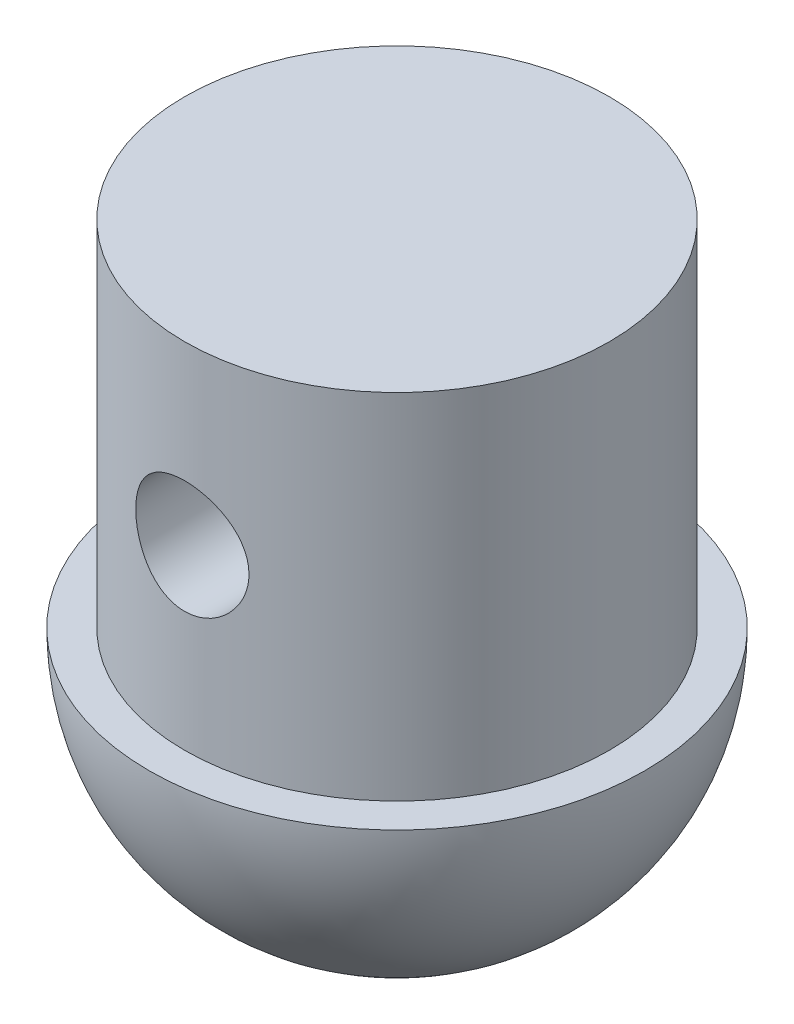
ISO-10303-21;
HEADER;
FILE_DESCRIPTION(('STEP AP214'),'2;1');
FILE_NAME('part.step','',(''),(''),'','','');
FILE_SCHEMA(('AUTOMOTIVE_DESIGN { 1 0 10303 214 1 1 1 1 }'));
ENDSEC;
DATA;
#1=APPLICATION_CONTEXT('core data for automotive mechanical design processes');
#2=APPLICATION_PROTOCOL_DEFINITION('international standard','automotive_design',2000,#1);
#3=PRODUCT_CONTEXT('',#1,'mechanical');
#4=PRODUCT('Part','Part','',(#3));
#5=PRODUCT_RELATED_PRODUCT_CATEGORY('part','',(#4));
#6=PRODUCT_DEFINITION_FORMATION('','',#4);
#7=PRODUCT_DEFINITION_CONTEXT('part definition',#1,'design');
#8=PRODUCT_DEFINITION('design','',#6,#7);
#9=PRODUCT_DEFINITION_SHAPE('','',#8);
#10=(LENGTH_UNIT() NAMED_UNIT(*) SI_UNIT(.MILLI.,.METRE.));
#11=(NAMED_UNIT(*) PLANE_ANGLE_UNIT() SI_UNIT($,.RADIAN.));
#12=(NAMED_UNIT(*) SI_UNIT($,.STERADIAN.) SOLID_ANGLE_UNIT());
#13=UNCERTAINTY_MEASURE_WITH_UNIT(LENGTH_MEASURE(1.E-05),#10,'distance_accuracy_value','');
#14=(GEOMETRIC_REPRESENTATION_CONTEXT(3) GLOBAL_UNCERTAINTY_ASSIGNED_CONTEXT((#13)) GLOBAL_UNIT_ASSIGNED_CONTEXT((#10,
#11,#12)) REPRESENTATION_CONTEXT('',''));
#15=CARTESIAN_POINT('',(0.,0.,0.));
#16=DIRECTION('',(0.,0.,1.));
#17=DIRECTION('',(1.,0.,0.));
#18=AXIS2_PLACEMENT_3D('',#15,#16,#17);
#19=CARTESIAN_POINT('',(0.,0.,0.));
#20=DIRECTION('',(0.,1.,0.));
#21=DIRECTION('',(1.,0.,0.));
#22=AXIS2_PLACEMENT_3D('',#19,#20,#21);
#23=SPHERICAL_SURFACE('',#22,7.);
#24=CARTESIAN_POINT('',(0.,0.,0.));
#25=DIRECTION('',(0.,1.,0.));
#26=DIRECTION('',(0.,0.,1.));
#27=AXIS2_PLACEMENT_3D('',#24,#25,#26);
#28=CIRCLE('',#27,7.);
#29=CARTESIAN_POINT('',(0.,0.,7.));
#30=VERTEX_POINT('',#29);
#31=EDGE_CURVE('E54',#30,#30,#28,.T.);
#32=ORIENTED_EDGE('',*,*,#31,.F.);
#33=EDGE_LOOP('',(#32));
#34=FACE_BOUND('',#33,.T.);
#35=ADVANCED_FACE('F43',(#34),#23,.T.);
#36=CARTESIAN_POINT('',(-7.49229768381106,0.,7.));
#37=DIRECTION('',(0.,-1.,0.));
#38=DIRECTION('',(0.,0.,1.));
#39=AXIS2_PLACEMENT_3D('',#36,#37,#38);
#40=PLANE('',#39);
#41=CARTESIAN_POINT('',(0.,0.,0.));
#42=DIRECTION('',(0.,1.,0.));
#43=DIRECTION('',(0.,0.,1.));
#44=AXIS2_PLACEMENT_3D('',#41,#42,#43);
#45=CIRCLE('',#44,6.);
#46=CARTESIAN_POINT('',(0.,0.,6.));
#47=VERTEX_POINT('',#46);
#48=EDGE_CURVE('E11',#47,#47,#45,.F.);
#49=ORIENTED_EDGE('',*,*,#48,.T.);
#50=EDGE_LOOP('',(#49));
#51=FACE_BOUND('',#50,.T.);
#52=ORIENTED_EDGE('',*,*,#31,.T.);
#53=EDGE_LOOP('',(#52));
#54=FACE_BOUND('',#53,.T.);
#55=ADVANCED_FACE('F73',(#51,#54),#40,.F.);
#56=CARTESIAN_POINT('',(0.,10.,0.));
#57=DIRECTION('',(0.,-1.,0.));
#58=DIRECTION('',(0.,0.,1.));
#59=AXIS2_PLACEMENT_3D('',#56,#57,#58);
#60=CYLINDRICAL_SURFACE('',#59,6.);
#61=CARTESIAN_POINT('',(0.,6.6,6.));
#62=CARTESIAN_POINT('',(-0.0882036446662835,6.59999790645212,5.9999986704813));
#63=CARTESIAN_POINT('',(-0.176429728177472,6.59268190864826,5.99803588929723));
#64=CARTESIAN_POINT('',(-0.350340361083571,6.56366301540905,5.99039658897325));
#65=CARTESIAN_POINT('',(-0.436023666655269,6.54195319645911,5.98471828266059));
#66=CARTESIAN_POINT('',(-0.60231327123625,6.48490266650877,5.97027466602242));
#67=CARTESIAN_POINT('',(-0.682925960812229,6.44957952986717,5.96151333704337));
#68=CARTESIAN_POINT('',(-0.837082949114126,6.36637020586672,5.94182959321305));
#69=CARTESIAN_POINT('',(-0.910626776359695,6.31848318131261,5.93090703436005));
#70=CARTESIAN_POINT('',(-1.05026360299202,6.21033318686926,5.90779691921738));
#71=CARTESIAN_POINT('',(-1.11616935189025,6.14983306559322,5.8955877414348));
#72=CARTESIAN_POINT('',(-1.23702970928508,6.01868121354948,5.87141927743138));
#73=CARTESIAN_POINT('',(-1.29198290796523,5.94802817790661,5.85946002355797));
#74=CARTESIAN_POINT('',(-1.39029127394741,5.797081412139,5.83692429973529));
#75=CARTESIAN_POINT('',(-1.43343102189222,5.71664293738822,5.82637510858234));
#76=CARTESIAN_POINT('',(-1.50550038461563,5.54932791112846,5.80817181846909));
#77=CARTESIAN_POINT('',(-1.53443261960976,5.46245255014382,5.8005171857408));
#78=CARTESIAN_POINT('',(-1.5766153618114,5.28680356973868,5.78919292669855));
#79=CARTESIAN_POINT('',(-1.59020536195949,5.19811716803828,5.78543718352246));
#80=CARTESIAN_POINT('',(-1.60237627764874,5.01964985333367,5.78207864835752));
#81=CARTESIAN_POINT('',(-1.60095999764589,4.92986914797151,5.78247508038722));
#82=CARTESIAN_POINT('',(-1.58342808002097,4.7544116677021,5.78729903015237));
#83=CARTESIAN_POINT('',(-1.56772324851795,4.66869025436957,5.79161388402152));
#84=CARTESIAN_POINT('',(-1.52271798977763,4.50114533243464,5.80360810471625));
#85=CARTESIAN_POINT('',(-1.493416475944,4.41932213593963,5.81128774043995));
#86=CARTESIAN_POINT('',(-1.421714855722,4.26082548495324,5.82924529396782));
#87=CARTESIAN_POINT('',(-1.37917072910226,4.18422052857102,5.83955154254446));
#88=CARTESIAN_POINT('',(-1.28229203059023,4.03909267291875,5.86158583714473));
#89=CARTESIAN_POINT('',(-1.22795513779401,3.97057136867482,5.8733141628429));
#90=CARTESIAN_POINT('',(-1.10693285810735,3.84120880203617,5.89734008503746));
#91=CARTESIAN_POINT('',(-1.03990250182639,3.78069094534804,5.90964377191026));
#92=CARTESIAN_POINT('',(-0.896494134565098,3.67168897571977,5.93309105021092));
#93=CARTESIAN_POINT('',(-0.820115755364072,3.62320533703806,5.94423459590854));
#94=CARTESIAN_POINT('',(-0.659678604397961,3.53950567774028,5.96417456318624));
#95=CARTESIAN_POINT('',(-0.575587922041431,3.50434818364113,5.97296058266845));
#96=CARTESIAN_POINT('',(-0.402401835512316,3.4487622489493,5.98712035520802));
#97=CARTESIAN_POINT('',(-0.313307529542658,3.42833058982083,5.99249485386999));
#98=CARTESIAN_POINT('',(-0.135403266516412,3.40328409846574,5.99911326846707));
#99=CARTESIAN_POINT('',(-0.0466593901131037,3.39822956811931,6.00047197976769));
#100=CARTESIAN_POINT('',(0.130408036720958,3.40286653139755,5.99923577353354));
#101=CARTESIAN_POINT('',(0.218731629649689,3.41255650088461,5.99664126464274));
#102=CARTESIAN_POINT('',(0.390881959921425,3.44604675796799,5.98786428396825));
#103=CARTESIAN_POINT('',(0.474759881622232,3.46960179695823,5.98174421237093));
#104=CARTESIAN_POINT('',(0.637365576940845,3.52986875560634,5.96661035915282));
#105=CARTESIAN_POINT('',(0.716092791372797,3.56658210100036,5.9575962639682));
#106=CARTESIAN_POINT('',(0.867870779734386,3.6529391097445,5.93740528447735));
#107=CARTESIAN_POINT('',(0.94078015076904,3.70282197343847,5.92618949284386));
#108=CARTESIAN_POINT('',(1.07734770831762,3.81380130412612,5.9028916189203));
#109=CARTESIAN_POINT('',(1.14100406303899,3.87489998607982,5.89080936580444));
#110=CARTESIAN_POINT('',(1.25911139583055,4.0086284619967,5.86671796694981));
#111=CARTESIAN_POINT('',(1.31325215399989,4.08153484912012,5.85472049149563));
#112=CARTESIAN_POINT('',(1.40853752947959,4.23565175687572,5.83253157740069));
#113=CARTESIAN_POINT('',(1.44968268897221,4.31686193088299,5.82234006342218));
#114=CARTESIAN_POINT('',(1.51749929269189,4.48487624567057,5.80503414721321));
#115=CARTESIAN_POINT('',(1.54425449804718,4.5716446494985,5.79790198738987));
#116=CARTESIAN_POINT('',(1.58272964096634,4.74867145578706,5.78751860185751));
#117=CARTESIAN_POINT('',(1.5944534208239,4.83892896029366,5.78426638438256));
#118=CARTESIAN_POINT('',(1.60231191722602,5.01719583029804,5.78209395637349));
#119=CARTESIAN_POINT('',(1.59894524494388,5.10518185620422,5.78303518188826));
#120=CARTESIAN_POINT('',(1.5778750080045,5.27928281121043,5.78881916870635));
#121=CARTESIAN_POINT('',(1.56017181228047,5.36539778840111,5.79366182961091));
#122=CARTESIAN_POINT('',(1.51122012559733,5.53268460170324,5.80662056856999));
#123=CARTESIAN_POINT('',(1.48007728860457,5.61388947418558,5.81471108015306));
#124=CARTESIAN_POINT('',(1.40521243649916,5.76998306442748,5.83325454509352));
#125=CARTESIAN_POINT('',(1.36148844819695,5.84487078904044,5.84370786897202));
#126=CARTESIAN_POINT('',(1.26119127415051,5.98858428759724,5.86618337152254));
#127=CARTESIAN_POINT('',(1.20427783814327,6.05716682798096,5.87824266481322));
#128=CARTESIAN_POINT('',(1.0798644280888,6.18396996133387,5.90236403026437));
#129=CARTESIAN_POINT('',(1.012361883487,6.24218803093508,5.91442610238761));
#130=CARTESIAN_POINT('',(0.866943984870946,6.34783379011748,5.93750249923166));
#131=CARTESIAN_POINT('',(0.788836769401423,6.39500400851946,5.94848889051638));
#132=CARTESIAN_POINT('',(0.625510912333512,6.47546993274349,5.9678704808232));
#133=CARTESIAN_POINT('',(0.540296875757037,6.50877454053088,5.97626734146876));
#134=CARTESIAN_POINT('',(0.379499763904792,6.55622022833241,5.98843802010774));
#135=CARTESIAN_POINT('',(0.304609613252028,6.572599506874,5.99274216474082));
#136=CARTESIAN_POINT('',(0.15315183625366,6.59448976493365,5.99852359229165));
#137=CARTESIAN_POINT('',(0.0765843763238879,6.60000181776002,6.00000115437816));
#138=CARTESIAN_POINT('',(0.,6.6,6.));
#139=B_SPLINE_CURVE_WITH_KNOTS('',3,(#61,#62,#63,#64,#65,#66,#67,#68,#69,#70,#71,#72,#73,#74,
#75,#76,#77,#78,#79,#80,#81,#82,#83,#84,#85,#86,#87,#88,#89,#90,#91,#92,#93,#94,#95,#96,#97,#98,
#99,#100,#101,#102,#103,#104,#105,#106,#107,#108,#109,#110,#111,#112,#113,#114,#115,#116,#117,
#118,#119,#120,#121,#122,#123,#124,#125,#126,#127,#128,#129,#130,#131,#132,#133,#134,#135,#136,
#137,#138),.UNSPECIFIED.,.T.,.F.,(4,2,2,2,2,2,2,2,2,2,2,2,2,2,2,2,2,2,2,2,2,2,2,2,2,2,2,2,2,2,2,
2,2,2,2,2,2,2,4),(0.,0.264330079159655,0.52878739500916,0.792904442377546,1.0570390936694,
1.32667918363974,1.59635395940119,1.87066066018583,2.1449167530376,2.41297726598071,
2.68098768318787,2.94152801632129,3.20208917445683,3.4655893867253,3.72914150489435,
4.00129007845189,4.27344937545409,4.54679047677765,4.82007181747443,5.08546174014969,
5.35082423135612,5.61162828509024,5.87246060615823,6.13840228798972,6.40439654602441,
6.67789197101562,6.95137598414617,7.2232503815319,7.49505526923061,7.75794673914764,
8.0208314440835,8.28168612350517,8.54258173690277,8.81115471648986,9.07979299457834,
9.35417801816593,9.62838660908019,9.85791855186544,10.0874278236498),.UNSPECIFIED.);
#140=CARTESIAN_POINT('',(0.,6.6,6.));
#141=VERTEX_POINT('',#140);
#142=EDGE_CURVE('E46',#141,#141,#139,.T.);
#143=ORIENTED_EDGE('',*,*,#142,.F.);
#144=EDGE_LOOP('',(#143));
#145=FACE_BOUND('',#144,.T.);
#146=CARTESIAN_POINT('',(1.6,5.,-5.78273291792039));
#147=CARTESIAN_POINT('',(1.59999787452612,4.91185924980899,-5.7827344455633));
#148=CARTESIAN_POINT('',(1.59269194579771,4.82369599961951,-5.78477011639344));
#149=CARTESIAN_POINT('',(1.56371666608212,4.64991566275457,-5.79266848924472));
#150=CARTESIAN_POINT('',(1.54204010896768,4.56429987601746,-5.79853311126453));
#151=CARTESIAN_POINT('',(1.48508676448053,4.39815354404267,-5.81337900141366));
#152=CARTESIAN_POINT('',(1.4498291003374,4.31761603293728,-5.82235588547335));
#153=CARTESIAN_POINT('',(1.36677427650964,4.16358660795211,-5.8424092393635));
#154=CARTESIAN_POINT('',(1.3189761427316,4.0900952419944,-5.85348587227547));
#155=CARTESIAN_POINT('',(1.21091878299647,3.95040596240983,-5.87680111642766));
#156=CARTESIAN_POINT('',(1.15040238003367,3.88441038602843,-5.88906032893152));
#157=CARTESIAN_POINT('',(1.01917941827217,3.76337473843904,-5.91318161149208));
#158=CARTESIAN_POINT('',(0.948471804277315,3.70833580308656,-5.92504364026752));
#159=CARTESIAN_POINT('',(0.797470536698616,3.60993204927766,-5.94726390774734));
#160=CARTESIAN_POINT('',(0.717041455903584,3.56676838509372,-5.95759501009834));
#161=CARTESIAN_POINT('',(0.549746435783273,3.49465229170619,-5.97535300969467));
#162=CARTESIAN_POINT('',(0.462881584700083,3.46569746617476,-5.9827803966101));
#163=CARTESIAN_POINT('',(0.287292769448073,3.42347582381139,-5.99374842861169));
#164=CARTESIAN_POINT('',(0.198656979360733,3.40986481869927,-5.99737421400212));
#165=CARTESIAN_POINT('',(0.0202908428068611,3.39763430391426,-6.000628196942));
#166=CARTESIAN_POINT('',(-0.0694393179508233,3.39901228509589,-6.00025706357286));
#167=CARTESIAN_POINT('',(-0.245051389689077,3.41647825003158,-5.99562140687813));
#168=CARTESIAN_POINT('',(-0.330973280576888,3.43219436610903,-5.99145531221602));
#169=CARTESIAN_POINT('',(-0.498913052456843,3.47728971022556,-5.97981398872374));
#170=CARTESIAN_POINT('',(-0.580930710544464,3.50666971734884,-5.97233857120463));
#171=CARTESIAN_POINT('',(-0.739683156118043,3.5785438780739,-5.95477255279922));
#172=CARTESIAN_POINT('',(-0.816357349063631,3.62116544568056,-5.94465670302171));
#173=CARTESIAN_POINT('',(-0.961591999011611,3.71821505560728,-5.9228997480757));
#174=CARTESIAN_POINT('',(-1.03015087046869,3.77264539922253,-5.91125834578275));
#175=CARTESIAN_POINT('',(-1.15942829557249,3.89374148634714,-5.88729018351104));
#176=CARTESIAN_POINT('',(-1.21984153614219,3.96073155603951,-5.87495335495478));
#177=CARTESIAN_POINT('',(-1.32865065683815,4.10401974099102,-5.85130724018329));
#178=CARTESIAN_POINT('',(-1.37704580423844,4.18031842336025,-5.83999801664631));
#179=CARTESIAN_POINT('',(-1.46067743349021,4.34072008145716,-5.81964721826454));
#180=CARTESIAN_POINT('',(-1.49583093280429,4.42486828073093,-5.81062005680583));
#181=CARTESIAN_POINT('',(-1.55139201348531,4.59818119956356,-5.79603460063156));
#182=CARTESIAN_POINT('',(-1.57180325169042,4.68734466915873,-5.79047544571885));
#183=CARTESIAN_POINT('',(-1.59677405674218,4.86530176881729,-5.78363868515234));
#184=CARTESIAN_POINT('',(-1.60178906096974,4.95402683888858,-5.78223810662157));
#185=CARTESIAN_POINT('',(-1.597079848984,5.13104781824197,-5.78354062803713));
#186=CARTESIAN_POINT('',(-1.58735720137773,5.21934377219377,-5.78624329125356));
#187=CARTESIAN_POINT('',(-1.55385017495931,5.39124527527808,-5.79532899431386));
#188=CARTESIAN_POINT('',(-1.53033958330325,5.47490835035108,-5.80164031753083));
#189=CARTESIAN_POINT('',(-1.47023189380392,5.63710370508665,-5.81716215168585));
#190=CARTESIAN_POINT('',(-1.43363308701324,5.71563531314159,-5.82637304120572));
#191=CARTESIAN_POINT('',(-1.34746324406962,5.86724396594853,-5.84690857976629));
#192=CARTESIAN_POINT('',(-1.29762476190339,5.94016318071188,-5.8582752389782));
#193=CARTESIAN_POINT('',(-1.18672182390013,6.07677064136243,-5.88174273547405));
#194=CARTESIAN_POINT('',(-1.12565525778373,6.14045714796329,-5.89384371048319));
#195=CARTESIAN_POINT('',(-0.991923026003871,6.25868197859996,-5.91783971907433));
#196=CARTESIAN_POINT('',(-0.918973132807077,6.31290270158287,-5.92971869219044));
#197=CARTESIAN_POINT('',(-0.764742748752595,6.40832878992841,-5.95157336013737));
#198=CARTESIAN_POINT('',(-0.683462701615108,6.44953484806313,-5.96154915626333));
#199=CARTESIAN_POINT('',(-0.515451307860698,6.51738370588921,-5.978409207194));
#200=CARTESIAN_POINT('',(-0.428766282305869,6.54413521555477,-5.98531646784308));
#201=CARTESIAN_POINT('',(-0.251919507785059,6.58263098245149,-5.99536243029798));
#202=CARTESIAN_POINT('',(-0.161758533856201,6.59437856541975,-5.99850196723977));
#203=CARTESIAN_POINT('',(0.0165136010769233,6.60232465899314,-6.0006193075016));
#204=CARTESIAN_POINT('',(0.104602809222308,6.59898905530491,-5.99972181030494));
#205=CARTESIAN_POINT('',(0.278918643704555,6.57794520513986,-5.9941479278306));
#206=CARTESIAN_POINT('',(0.365145339850183,6.56023749830647,-5.98947168443723));
#207=CARTESIAN_POINT('',(0.532728098771435,6.51121551606502,-5.97689048312844));
#208=CARTESIAN_POINT('',(0.614113609481483,6.47999576522167,-5.96900797751776));
#209=CARTESIAN_POINT('',(0.770537678776833,6.40492031860338,-5.95083853212803));
#210=CARTESIAN_POINT('',(0.845575345328785,6.36106285071116,-5.9405512551794));
#211=CARTESIAN_POINT('',(0.989342614939896,6.26059338228894,-5.91833064980799));
#212=CARTESIAN_POINT('',(1.05785068939027,6.20367249543562,-5.90636074702983));
#213=CARTESIAN_POINT('',(1.18450029724544,6.07927780051353,-5.88227200056129));
#214=CARTESIAN_POINT('',(1.24263909793084,6.0118012193649,-5.87015311850574));
#215=CARTESIAN_POINT('',(1.34816560187261,5.86642528332748,-5.84683167732792));
#216=CARTESIAN_POINT('',(1.39528875413901,5.7883293490008,-5.83565513061492));
#217=CARTESIAN_POINT('',(1.47566951228968,5.62503495123749,-5.81585115203583));
#218=CARTESIAN_POINT('',(1.50893618695116,5.53984117714822,-5.80722205399804));
#219=CARTESIAN_POINT('',(1.5563049940103,5.37913493117279,-5.79468800506476));
#220=CARTESIAN_POINT('',(1.57265214719335,5.30431898835834,-5.79024112213281));
#221=CARTESIAN_POINT('',(1.59449995435361,5.15300755360111,-5.78426308173731));
#222=CARTESIAN_POINT('',(1.60000184505801,5.07651225416789,-5.7827315918209));
#223=CARTESIAN_POINT('',(1.6,5.,-5.78273291792039));
#224=B_SPLINE_CURVE_WITH_KNOTS('',3,(#146,#147,#148,#149,#150,#151,#152,#153,#154,#155,#156,
#157,#158,#159,#160,#161,#162,#163,#164,#165,#166,#167,#168,#169,#170,#171,#172,#173,#174,#175,
#176,#177,#178,#179,#180,#181,#182,#183,#184,#185,#186,#187,#188,#189,#190,#191,#192,#193,#194,
#195,#196,#197,#198,#199,#200,#201,#202,#203,#204,#205,#206,#207,#208,#209,#210,#211,#212,#213,
#214,#215,#216,#217,#218,#219,#220,#221,#222,#223),.UNSPECIFIED.,.T.,.F.,(4,2,2,2,2,2,2,2,2,2,2,
2,2,2,2,2,2,2,2,2,2,2,2,2,2,2,2,2,2,2,2,2,2,2,2,2,2,2,4),(0.,0.264140902492821,
0.528414358280161,0.792317049276934,1.05624024524884,1.32612732904169,1.59604237699569,
1.87028165896643,2.14447467443397,2.41238643453184,2.68025334708482,2.94136456640643,
3.20249067552556,3.46621159124456,3.72998394715593,4.00185409840264,4.27374082111663,
4.54730412077229,4.82079953934806,5.08612267391536,5.35141757070658,5.61161480341915,
5.87184602287714,6.13779707970073,6.40379817229035,6.67748725563562,6.95116176802338,
7.22274831668976,7.4942746556306,7.75747243929026,8.02066034086225,8.28203611890788,
8.54344856608626,8.81183083189117,9.08028372300693,9.35464031183427,9.6288170567485,
9.85813574131029,10.0874282742632),.UNSPECIFIED.);
#225=CARTESIAN_POINT('',(1.6,5.,-5.78273291792039));
#226=VERTEX_POINT('',#225);
#227=EDGE_CURVE('E62',#226,#226,#224,.T.);
#228=ORIENTED_EDGE('',*,*,#227,.F.);
#229=EDGE_LOOP('',(#228));
#230=FACE_BOUND('',#229,.T.);
#231=CARTESIAN_POINT('',(0.,10.,0.));
#232=DIRECTION('',(0.,-1.,0.));
#233=DIRECTION('',(0.,0.,-1.));
#234=AXIS2_PLACEMENT_3D('',#231,#232,#233);
#235=CIRCLE('',#234,6.);
#236=CARTESIAN_POINT('',(0.,10.,-6.));
#237=VERTEX_POINT('',#236);
#238=EDGE_CURVE('E59',#237,#237,#235,.T.);
#239=ORIENTED_EDGE('',*,*,#238,.T.);
#240=EDGE_LOOP('',(#239));
#241=FACE_BOUND('',#240,.T.);
#242=ORIENTED_EDGE('',*,*,#48,.F.);
#243=EDGE_LOOP('',(#242));
#244=FACE_BOUND('',#243,.T.);
#245=ADVANCED_FACE('F69',(#145,#230,#241,#244),#60,.T.);
#246=CARTESIAN_POINT('',(0.,10.,0.));
#247=DIRECTION('',(0.,1.,0.));
#248=DIRECTION('',(0.,0.,-1.));
#249=AXIS2_PLACEMENT_3D('',#246,#247,#248);
#250=PLANE('',#249);
#251=ORIENTED_EDGE('',*,*,#238,.F.);
#252=EDGE_LOOP('',(#251));
#253=FACE_BOUND('',#252,.T.);
#254=ADVANCED_FACE('F72',(#253),#250,.T.);
#255=CARTESIAN_POINT('',(0.,5.,7.));
#256=DIRECTION('',(0.,0.,-1.));
#257=DIRECTION('',(1.,0.,0.));
#258=AXIS2_PLACEMENT_3D('',#255,#256,#257);
#259=CYLINDRICAL_SURFACE('',#258,1.6);
#260=ORIENTED_EDGE('',*,*,#227,.T.);
#261=EDGE_LOOP('',(#260));
#262=FACE_BOUND('',#261,.T.);
#263=ORIENTED_EDGE('',*,*,#142,.T.);
#264=EDGE_LOOP('',(#263));
#265=FACE_BOUND('',#264,.T.);
#266=ADVANCED_FACE('F66',(#262,#265),#259,.F.);
#267=CLOSED_SHELL('',(#35,#55,#245,#254,#266));
#268=MANIFOLD_SOLID_BREP('B2',#267);
#269=CARTESIAN_POINT('',(0.,0.,0.));
#270=DIRECTION('',(0.,1.,0.));
#271=DIRECTION('',(1.,0.,0.));
#272=AXIS2_PLACEMENT_3D('',#269,#270,#271);
#273=SPHERICAL_SURFACE('',#272,7.);
#274=CARTESIAN_POINT('',(0.,0.,0.));
#275=DIRECTION('',(0.915664164822438,-0.401944196699029,0.));
#276=DIRECTION('',(-0.401944196699029,-0.915664164822438,0.));
#277=AXIS2_PLACEMENT_3D('',#274,#275,#276);
#278=SPHERICAL_SURFACE('',#277,7.);
#279=CARTESIAN_POINT('',(-6.28184853391924,2.75750942294523,0.));
#280=DIRECTION('',(0.915664164822438,-0.401944196699029,0.));
#281=DIRECTION('',(-0.401944196699029,-0.915664164822438,0.));
#282=AXIS2_PLACEMENT_3D('',#279,#280,#281);
#283=CIRCLE('',#282,1.39087051132196);
#284=CARTESIAN_POINT('',(-6.84090086430491,1.48393913781945,0.));
#285=VERTEX_POINT('',#284);
#286=EDGE_CURVE('E42',#285,#285,#283,.T.);
#287=ORIENTED_EDGE('',*,*,#286,.F.);
#288=EDGE_LOOP('',(#287));
#289=FACE_BOUND('',#288,.T.);
#290=ADVANCED_FACE('F128',(#289),#278,.T.);
#291=CARTESIAN_POINT('',(-4.44764178502422,6.93599341309035,7.));
#292=DIRECTION('',(-0.915664164822438,0.401944196699029,0.));
#293=DIRECTION('',(-0.401944196699029,-0.915664164822438,0.));
#294=AXIS2_PLACEMENT_3D('',#291,#292,#293);
#295=PLANE('',#294);
#296=ORIENTED_EDGE('',*,*,#286,.T.);
#297=EDGE_LOOP('',(#296));
#298=FACE_BOUND('',#297,.T.);
#299=ADVANCED_FACE('F135',(#298),#295,.F.);
#300=CLOSED_SHELL('',(#290,#299));
#301=MANIFOLD_SOLID_BREP('B6',#300);
#302=ADVANCED_BREP_SHAPE_REPRESENTATION('',(#18,#268,#301),#14);
#303=SHAPE_DEFINITION_REPRESENTATION(#9,#302);
ENDSEC;
END-ISO-10303-21;
